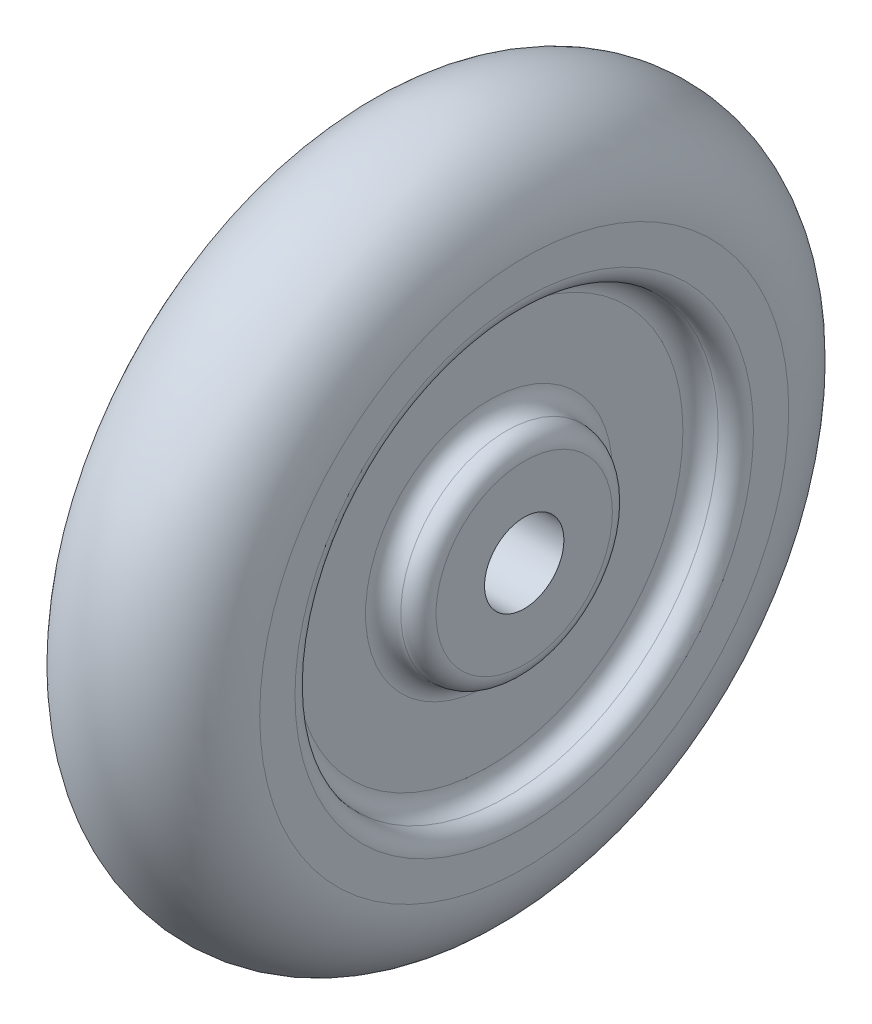
ISO-10303-21;
HEADER;
FILE_DESCRIPTION(('STEP AP214'),'2;1');
FILE_NAME('part.step','',(''),(''),'','','');
FILE_SCHEMA(('AUTOMOTIVE_DESIGN { 1 0 10303 214 1 1 1 1 }'));
ENDSEC;
DATA;
#1=APPLICATION_CONTEXT('core data for automotive mechanical design processes');
#2=APPLICATION_PROTOCOL_DEFINITION('international standard','automotive_design',2000,#1);
#3=PRODUCT_CONTEXT('',#1,'mechanical');
#4=PRODUCT('Part','Part','',(#3));
#5=PRODUCT_RELATED_PRODUCT_CATEGORY('part','',(#4));
#6=PRODUCT_DEFINITION_FORMATION('','',#4);
#7=PRODUCT_DEFINITION_CONTEXT('part definition',#1,'design');
#8=PRODUCT_DEFINITION('design','',#6,#7);
#9=PRODUCT_DEFINITION_SHAPE('','',#8);
#10=(LENGTH_UNIT() NAMED_UNIT(*) SI_UNIT(.MILLI.,.METRE.));
#11=(NAMED_UNIT(*) PLANE_ANGLE_UNIT() SI_UNIT($,.RADIAN.));
#12=(NAMED_UNIT(*) SI_UNIT($,.STERADIAN.) SOLID_ANGLE_UNIT());
#13=UNCERTAINTY_MEASURE_WITH_UNIT(LENGTH_MEASURE(1.E-05),#10,'distance_accuracy_value','');
#14=(GEOMETRIC_REPRESENTATION_CONTEXT(3) GLOBAL_UNCERTAINTY_ASSIGNED_CONTEXT((#13)) GLOBAL_UNIT_ASSIGNED_CONTEXT((#10,
#11,#12)) REPRESENTATION_CONTEXT('',''));
#15=CARTESIAN_POINT('',(0.,0.,0.));
#16=DIRECTION('',(0.,0.,1.));
#17=DIRECTION('',(1.,0.,0.));
#18=AXIS2_PLACEMENT_3D('',#15,#16,#17);
#19=CARTESIAN_POINT('',(-5.,15.,0.));
#20=DIRECTION('',(-1.,0.,0.));
#21=DIRECTION('',(0.,0.,1.));
#22=AXIS2_PLACEMENT_3D('',#19,#20,#21);
#23=PLANE('',#22);
#24=CARTESIAN_POINT('',(-5.,0.,0.));
#25=DIRECTION('',(1.,0.,0.));
#26=DIRECTION('',(0.,0.,-1.));
#27=AXIS2_PLACEMENT_3D('',#24,#25,#26);
#28=CIRCLE('',#27,2.25);
#29=CARTESIAN_POINT('',(-5.,0.,-2.25));
#30=VERTEX_POINT('',#29);
#31=EDGE_CURVE('E104',#30,#30,#28,.T.);
#32=ORIENTED_EDGE('',*,*,#31,.T.);
#33=EDGE_LOOP('',(#32));
#34=FACE_BOUND('',#33,.T.);
#35=CARTESIAN_POINT('',(-5.,0.,0.));
#36=DIRECTION('',(1.,0.,0.));
#37=DIRECTION('',(0.,0.,-1.));
#38=AXIS2_PLACEMENT_3D('',#35,#36,#37);
#39=CIRCLE('',#38,5.);
#40=CARTESIAN_POINT('',(-5.,0.,-5.));
#41=VERTEX_POINT('',#40);
#42=EDGE_CURVE('E56',#41,#41,#39,.T.);
#43=ORIENTED_EDGE('',*,*,#42,.F.);
#44=EDGE_LOOP('',(#43));
#45=FACE_BOUND('',#44,.T.);
#46=ADVANCED_FACE('F43',(#34,#45),#23,.T.);
#47=CARTESIAN_POINT('',(-4.,0.,0.));
#48=DIRECTION('',(-1.,0.,0.));
#49=DIRECTION('',(0.,0.,-1.));
#50=AXIS2_PLACEMENT_3D('',#47,#48,#49);
#51=TOROIDAL_SURFACE('',#50,13.,1.);
#52=CARTESIAN_POINT('',(-5.,0.,0.));
#53=DIRECTION('',(1.,0.,0.));
#54=DIRECTION('',(0.,0.,-1.));
#55=AXIS2_PLACEMENT_3D('',#52,#53,#54);
#56=CIRCLE('',#55,13.);
#57=CARTESIAN_POINT('',(-5.,0.,-13.));
#58=VERTEX_POINT('',#57);
#59=EDGE_CURVE('E10',#58,#58,#56,.F.);
#60=ORIENTED_EDGE('',*,*,#59,.T.);
#61=EDGE_LOOP('',(#60));
#62=FACE_BOUND('',#61,.T.);
#63=CARTESIAN_POINT('',(-4.,0.,0.));
#64=DIRECTION('',(1.,0.,0.));
#65=DIRECTION('',(0.,0.,-1.));
#66=AXIS2_PLACEMENT_3D('',#63,#64,#65);
#67=CIRCLE('',#66,12.);
#68=CARTESIAN_POINT('',(-4.,0.,-12.));
#69=VERTEX_POINT('',#68);
#70=EDGE_CURVE('E51',#69,#69,#67,.T.);
#71=ORIENTED_EDGE('',*,*,#70,.T.);
#72=EDGE_LOOP('',(#71));
#73=FACE_BOUND('',#72,.T.);
#74=ADVANCED_FACE('F45',(#62,#73),#51,.T.);
#75=CARTESIAN_POINT('',(-4.,0.,0.));
#76=DIRECTION('',(-1.,0.,0.));
#77=DIRECTION('',(0.,0.,-1.));
#78=AXIS2_PLACEMENT_3D('',#75,#76,#77);
#79=TOROIDAL_SURFACE('',#78,11.,1.);
#80=ORIENTED_EDGE('',*,*,#70,.F.);
#81=EDGE_LOOP('',(#80));
#82=FACE_BOUND('',#81,.T.);
#83=CARTESIAN_POINT('',(-3.,0.,0.));
#84=DIRECTION('',(1.,0.,0.));
#85=DIRECTION('',(0.,0.,-1.));
#86=AXIS2_PLACEMENT_3D('',#83,#84,#85);
#87=CIRCLE('',#86,11.);
#88=CARTESIAN_POINT('',(-3.,0.,-11.));
#89=VERTEX_POINT('',#88);
#90=EDGE_CURVE('E71',#89,#89,#87,.T.);
#91=ORIENTED_EDGE('',*,*,#90,.T.);
#92=EDGE_LOOP('',(#91));
#93=FACE_BOUND('',#92,.T.);
#94=ADVANCED_FACE('F142',(#82,#93),#79,.F.);
#95=CARTESIAN_POINT('',(-4.,0.,0.));
#96=DIRECTION('',(-1.,0.,0.));
#97=DIRECTION('',(0.,0.,-1.));
#98=AXIS2_PLACEMENT_3D('',#95,#96,#97);
#99=TOROIDAL_SURFACE('',#98,5.,1.);
#100=ORIENTED_EDGE('',*,*,#42,.T.);
#101=EDGE_LOOP('',(#100));
#102=FACE_BOUND('',#101,.T.);
#103=CARTESIAN_POINT('',(-4.,0.,0.));
#104=DIRECTION('',(1.,0.,0.));
#105=DIRECTION('',(0.,0.,-1.));
#106=AXIS2_PLACEMENT_3D('',#103,#104,#105);
#107=CIRCLE('',#106,6.);
#108=CARTESIAN_POINT('',(-4.,0.,-6.));
#109=VERTEX_POINT('',#108);
#110=EDGE_CURVE('E61',#109,#109,#107,.F.);
#111=ORIENTED_EDGE('',*,*,#110,.T.);
#112=EDGE_LOOP('',(#111));
#113=FACE_BOUND('',#112,.T.);
#114=ADVANCED_FACE('F184',(#102,#113),#99,.T.);
#115=CARTESIAN_POINT('',(-4.,0.,0.));
#116=DIRECTION('',(-1.,0.,0.));
#117=DIRECTION('',(0.,0.,-1.));
#118=AXIS2_PLACEMENT_3D('',#115,#116,#117);
#119=TOROIDAL_SURFACE('',#118,7.,1.);
#120=CARTESIAN_POINT('',(-3.,0.,0.));
#121=DIRECTION('',(1.,0.,0.));
#122=DIRECTION('',(0.,0.,-1.));
#123=AXIS2_PLACEMENT_3D('',#120,#121,#122);
#124=CIRCLE('',#123,7.);
#125=CARTESIAN_POINT('',(-3.,0.,-7.));
#126=VERTEX_POINT('',#125);
#127=EDGE_CURVE('E67',#126,#126,#124,.F.);
#128=ORIENTED_EDGE('',*,*,#127,.T.);
#129=EDGE_LOOP('',(#128));
#130=FACE_BOUND('',#129,.T.);
#131=ORIENTED_EDGE('',*,*,#110,.F.);
#132=EDGE_LOOP('',(#131));
#133=FACE_BOUND('',#132,.T.);
#134=ADVANCED_FACE('F180',(#130,#133),#119,.F.);
#135=CARTESIAN_POINT('',(-3.,0.,0.));
#136=DIRECTION('',(-1.,0.,0.));
#137=DIRECTION('',(0.,0.,-1.));
#138=AXIS2_PLACEMENT_3D('',#135,#136,#137);
#139=PLANE('',#138);
#140=ORIENTED_EDGE('',*,*,#90,.F.);
#141=EDGE_LOOP('',(#140));
#142=FACE_BOUND('',#141,.T.);
#143=ORIENTED_EDGE('',*,*,#127,.F.);
#144=EDGE_LOOP('',(#143));
#145=FACE_BOUND('',#144,.T.);
#146=ADVANCED_FACE('F132',(#142,#145),#139,.T.);
#147=CARTESIAN_POINT('',(5.,15.,0.));
#148=DIRECTION('',(1.,0.,0.));
#149=DIRECTION('',(0.,0.,-1.));
#150=AXIS2_PLACEMENT_3D('',#147,#148,#149);
#151=PLANE('',#150);
#152=CARTESIAN_POINT('',(5.,0.,0.));
#153=DIRECTION('',(1.,0.,0.));
#154=DIRECTION('',(0.,0.,-1.));
#155=AXIS2_PLACEMENT_3D('',#152,#153,#154);
#156=CIRCLE('',#155,5.);
#157=CARTESIAN_POINT('',(5.,0.,-5.));
#158=VERTEX_POINT('',#157);
#159=EDGE_CURVE('E88',#158,#158,#156,.T.);
#160=ORIENTED_EDGE('',*,*,#159,.T.);
#161=EDGE_LOOP('',(#160));
#162=FACE_BOUND('',#161,.T.);
#163=CARTESIAN_POINT('',(5.,0.,0.));
#164=DIRECTION('',(1.,0.,0.));
#165=DIRECTION('',(0.,0.,-1.));
#166=AXIS2_PLACEMENT_3D('',#163,#164,#165);
#167=CIRCLE('',#166,2.25);
#168=CARTESIAN_POINT('',(5.,0.,-2.25));
#169=VERTEX_POINT('',#168);
#170=EDGE_CURVE('E108',#169,#169,#167,.T.);
#171=ORIENTED_EDGE('',*,*,#170,.F.);
#172=EDGE_LOOP('',(#171));
#173=FACE_BOUND('',#172,.T.);
#174=ADVANCED_FACE('F121',(#162,#173),#151,.T.);
#175=CARTESIAN_POINT('',(0.,0.,0.));
#176=DIRECTION('',(1.,0.,0.));
#177=DIRECTION('',(0.,0.,-1.));
#178=AXIS2_PLACEMENT_3D('',#175,#176,#177);
#179=TOROIDAL_SURFACE('',#178,15.,5.);
#180=CARTESIAN_POINT('',(-5.,0.,0.));
#181=DIRECTION('',(1.,0.,0.));
#182=DIRECTION('',(0.,0.,-1.));
#183=AXIS2_PLACEMENT_3D('',#180,#181,#182);
#184=CIRCLE('',#183,15.);
#185=CARTESIAN_POINT('',(-5.,0.,-15.));
#186=VERTEX_POINT('',#185);
#187=EDGE_CURVE('E100',#186,#186,#184,.T.);
#188=ORIENTED_EDGE('',*,*,#187,.T.);
#189=EDGE_LOOP('',(#188));
#190=FACE_BOUND('',#189,.T.);
#191=CARTESIAN_POINT('',(5.,0.,0.));
#192=DIRECTION('',(1.,0.,0.));
#193=DIRECTION('',(0.,0.,-1.));
#194=AXIS2_PLACEMENT_3D('',#191,#192,#193);
#195=CIRCLE('',#194,15.);
#196=CARTESIAN_POINT('',(5.,0.,-15.));
#197=VERTEX_POINT('',#196);
#198=EDGE_CURVE('E84',#197,#197,#195,.T.);
#199=ORIENTED_EDGE('',*,*,#198,.F.);
#200=EDGE_LOOP('',(#199));
#201=FACE_BOUND('',#200,.T.);
#202=ADVANCED_FACE('F118',(#190,#201),#179,.T.);
#203=ORIENTED_EDGE('',*,*,#59,.F.);
#204=EDGE_LOOP('',(#203));
#205=FACE_BOUND('',#204,.T.);
#206=ORIENTED_EDGE('',*,*,#187,.F.);
#207=EDGE_LOOP('',(#206));
#208=FACE_BOUND('',#207,.T.);
#209=ADVANCED_FACE('F120',(#205,#208),#23,.T.);
#210=CARTESIAN_POINT('',(0.,0.,0.));
#211=DIRECTION('',(1.,0.,0.));
#212=DIRECTION('',(0.,0.,-1.));
#213=AXIS2_PLACEMENT_3D('',#210,#211,#212);
#214=CYLINDRICAL_SURFACE('',#213,2.25);
#215=ORIENTED_EDGE('',*,*,#170,.T.);
#216=EDGE_LOOP('',(#215));
#217=FACE_BOUND('',#216,.T.);
#218=ORIENTED_EDGE('',*,*,#31,.F.);
#219=EDGE_LOOP('',(#218));
#220=FACE_BOUND('',#219,.T.);
#221=ADVANCED_FACE('F128',(#217,#220),#214,.F.);
#222=CARTESIAN_POINT('',(5.,0.,0.));
#223=DIRECTION('',(1.,0.,0.));
#224=DIRECTION('',(0.,0.,-1.));
#225=AXIS2_PLACEMENT_3D('',#222,#223,#224);
#226=CIRCLE('',#225,13.);
#227=CARTESIAN_POINT('',(5.,0.,-13.));
#228=VERTEX_POINT('',#227);
#229=EDGE_CURVE('E75',#228,#228,#226,.F.);
#230=ORIENTED_EDGE('',*,*,#229,.T.);
#231=EDGE_LOOP('',(#230));
#232=FACE_BOUND('',#231,.T.);
#233=ORIENTED_EDGE('',*,*,#198,.T.);
#234=EDGE_LOOP('',(#233));
#235=FACE_BOUND('',#234,.T.);
#236=ADVANCED_FACE('F116',(#232,#235),#151,.T.);
#237=CARTESIAN_POINT('',(3.,0.,0.));
#238=DIRECTION('',(1.,0.,0.));
#239=DIRECTION('',(0.,0.,-1.));
#240=AXIS2_PLACEMENT_3D('',#237,#238,#239);
#241=PLANE('',#240);
#242=CARTESIAN_POINT('',(3.,0.,0.));
#243=DIRECTION('',(1.,0.,0.));
#244=DIRECTION('',(0.,0.,-1.));
#245=AXIS2_PLACEMENT_3D('',#242,#243,#244);
#246=CIRCLE('',#245,11.);
#247=CARTESIAN_POINT('',(3.,0.,-11.));
#248=VERTEX_POINT('',#247);
#249=EDGE_CURVE('E92',#248,#248,#246,.T.);
#250=ORIENTED_EDGE('',*,*,#249,.T.);
#251=EDGE_LOOP('',(#250));
#252=FACE_BOUND('',#251,.T.);
#253=CARTESIAN_POINT('',(3.,0.,0.));
#254=DIRECTION('',(1.,0.,0.));
#255=DIRECTION('',(0.,0.,-1.));
#256=AXIS2_PLACEMENT_3D('',#253,#254,#255);
#257=CIRCLE('',#256,7.);
#258=CARTESIAN_POINT('',(3.,0.,-7.));
#259=VERTEX_POINT('',#258);
#260=EDGE_CURVE('E96',#259,#259,#257,.F.);
#261=ORIENTED_EDGE('',*,*,#260,.T.);
#262=EDGE_LOOP('',(#261));
#263=FACE_BOUND('',#262,.T.);
#264=ADVANCED_FACE('F148',(#252,#263),#241,.T.);
#265=CARTESIAN_POINT('',(4.,0.,0.));
#266=DIRECTION('',(1.,0.,0.));
#267=DIRECTION('',(0.,0.,-1.));
#268=AXIS2_PLACEMENT_3D('',#265,#266,#267);
#269=TOROIDAL_SURFACE('',#268,13.,1.);
#270=ORIENTED_EDGE('',*,*,#229,.F.);
#271=EDGE_LOOP('',(#270));
#272=FACE_BOUND('',#271,.T.);
#273=CARTESIAN_POINT('',(4.,0.,0.));
#274=DIRECTION('',(1.,0.,0.));
#275=DIRECTION('',(0.,0.,-1.));
#276=AXIS2_PLACEMENT_3D('',#273,#274,#275);
#277=CIRCLE('',#276,12.);
#278=CARTESIAN_POINT('',(4.,0.,-12.));
#279=VERTEX_POINT('',#278);
#280=EDGE_CURVE('E80',#279,#279,#277,.T.);
#281=ORIENTED_EDGE('',*,*,#280,.F.);
#282=EDGE_LOOP('',(#281));
#283=FACE_BOUND('',#282,.T.);
#284=ADVANCED_FACE('F151',(#272,#283),#269,.T.);
#285=CARTESIAN_POINT('',(4.,0.,0.));
#286=DIRECTION('',(1.,0.,0.));
#287=DIRECTION('',(0.,0.,-1.));
#288=AXIS2_PLACEMENT_3D('',#285,#286,#287);
#289=TOROIDAL_SURFACE('',#288,11.,1.);
#290=ORIENTED_EDGE('',*,*,#280,.T.);
#291=EDGE_LOOP('',(#290));
#292=FACE_BOUND('',#291,.T.);
#293=ORIENTED_EDGE('',*,*,#249,.F.);
#294=EDGE_LOOP('',(#293));
#295=FACE_BOUND('',#294,.T.);
#296=ADVANCED_FACE('F156',(#292,#295),#289,.F.);
#297=CARTESIAN_POINT('',(4.,0.,0.));
#298=DIRECTION('',(1.,0.,0.));
#299=DIRECTION('',(0.,0.,-1.));
#300=AXIS2_PLACEMENT_3D('',#297,#298,#299);
#301=TOROIDAL_SURFACE('',#300,5.,1.);
#302=ORIENTED_EDGE('',*,*,#159,.F.);
#303=EDGE_LOOP('',(#302));
#304=FACE_BOUND('',#303,.T.);
#305=CARTESIAN_POINT('',(4.,0.,0.));
#306=DIRECTION('',(1.,0.,0.));
#307=DIRECTION('',(0.,0.,-1.));
#308=AXIS2_PLACEMENT_3D('',#305,#306,#307);
#309=CIRCLE('',#308,6.);
#310=CARTESIAN_POINT('',(4.,0.,-6.));
#311=VERTEX_POINT('',#310);
#312=EDGE_CURVE('E76',#311,#311,#309,.F.);
#313=ORIENTED_EDGE('',*,*,#312,.F.);
#314=EDGE_LOOP('',(#313));
#315=FACE_BOUND('',#314,.T.);
#316=ADVANCED_FACE('F165',(#304,#315),#301,.T.);
#317=CARTESIAN_POINT('',(4.,0.,0.));
#318=DIRECTION('',(1.,0.,0.));
#319=DIRECTION('',(0.,0.,-1.));
#320=AXIS2_PLACEMENT_3D('',#317,#318,#319);
#321=TOROIDAL_SURFACE('',#320,7.,1.);
#322=ORIENTED_EDGE('',*,*,#260,.F.);
#323=EDGE_LOOP('',(#322));
#324=FACE_BOUND('',#323,.T.);
#325=ORIENTED_EDGE('',*,*,#312,.T.);
#326=EDGE_LOOP('',(#325));
#327=FACE_BOUND('',#326,.T.);
#328=ADVANCED_FACE('F163',(#324,#327),#321,.F.);
#329=CLOSED_SHELL('',(#46,#74,#94,#114,#134,#146,#174,#202,#209,#221,#236,#264,#284,#296,#316,#328));
#330=MANIFOLD_SOLID_BREP('B2',#329);
#331=ADVANCED_BREP_SHAPE_REPRESENTATION('',(#18,#330),#14);
#332=SHAPE_DEFINITION_REPRESENTATION(#9,#331);
ENDSEC;
END-ISO-10303-21;
